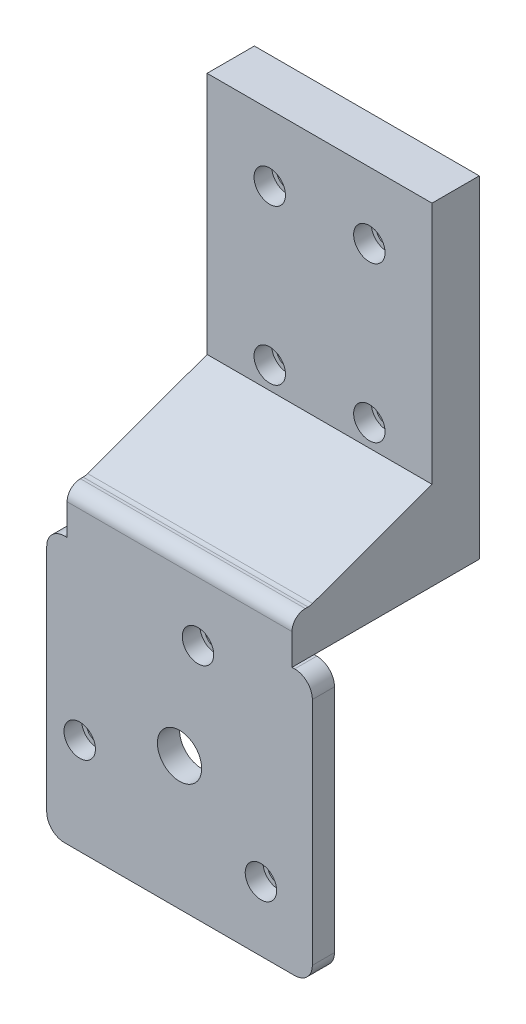
ISO-10303-21;
HEADER;
FILE_DESCRIPTION(('STEP AP214'),'2;1');
FILE_NAME('part.step','',(''),(''),'','','');
FILE_SCHEMA(('AUTOMOTIVE_DESIGN { 1 0 10303 214 1 1 1 1 }'));
ENDSEC;
DATA;
#1=APPLICATION_CONTEXT('core data for automotive mechanical design processes');
#2=APPLICATION_PROTOCOL_DEFINITION('international standard','automotive_design',2000,#1);
#3=PRODUCT_CONTEXT('',#1,'mechanical');
#4=PRODUCT('Part','Part','',(#3));
#5=PRODUCT_RELATED_PRODUCT_CATEGORY('part','',(#4));
#6=PRODUCT_DEFINITION_FORMATION('','',#4);
#7=PRODUCT_DEFINITION_CONTEXT('part definition',#1,'design');
#8=PRODUCT_DEFINITION('design','',#6,#7);
#9=PRODUCT_DEFINITION_SHAPE('','',#8);
#10=(LENGTH_UNIT() NAMED_UNIT(*) SI_UNIT(.MILLI.,.METRE.));
#11=(NAMED_UNIT(*) PLANE_ANGLE_UNIT() SI_UNIT($,.RADIAN.));
#12=(NAMED_UNIT(*) SI_UNIT($,.STERADIAN.) SOLID_ANGLE_UNIT());
#13=UNCERTAINTY_MEASURE_WITH_UNIT(LENGTH_MEASURE(1.E-05),#10,'distance_accuracy_value','');
#14=(GEOMETRIC_REPRESENTATION_CONTEXT(3) GLOBAL_UNCERTAINTY_ASSIGNED_CONTEXT((#13)) GLOBAL_UNIT_ASSIGNED_CONTEXT((#10,
#11,#12)) REPRESENTATION_CONTEXT('',''));
#15=CARTESIAN_POINT('',(0.,0.,0.));
#16=DIRECTION('',(0.,0.,1.));
#17=DIRECTION('',(1.,0.,0.));
#18=AXIS2_PLACEMENT_3D('',#15,#16,#17);
#19=CARTESIAN_POINT('',(-11.25,120.000000038,7.5));
#20=DIRECTION('',(0.,0.,-1.));
#21=DIRECTION('',(-1.,0.,0.));
#22=AXIS2_PLACEMENT_3D('',#19,#20,#21);
#23=CYLINDRICAL_SURFACE('',#22,2.5);
#24=CARTESIAN_POINT('',(-11.25,120.000000038,3.5));
#25=DIRECTION('',(0.,0.,1.));
#26=DIRECTION('',(1.,0.,0.));
#27=AXIS2_PLACEMENT_3D('',#24,#25,#26);
#28=CIRCLE('',#27,2.5);
#29=CARTESIAN_POINT('',(-8.75,120.000000038,3.5));
#30=VERTEX_POINT('',#29);
#31=EDGE_CURVE('E50',#30,#30,#28,.T.);
#32=ORIENTED_EDGE('',*,*,#31,.T.);
#33=EDGE_LOOP('',(#32));
#34=FACE_BOUND('',#33,.T.);
#35=CARTESIAN_POINT('',(-11.25,120.000000038,-3.18));
#36=DIRECTION('',(0.,0.,1.));
#37=DIRECTION('',(1.,0.,0.));
#38=AXIS2_PLACEMENT_3D('',#35,#36,#37);
#39=CIRCLE('',#38,2.5);
#40=CARTESIAN_POINT('',(-8.75,120.000000038,-3.18));
#41=VERTEX_POINT('',#40);
#42=EDGE_CURVE('E212',#41,#41,#39,.T.);
#43=ORIENTED_EDGE('',*,*,#42,.F.);
#44=EDGE_LOOP('',(#43));
#45=FACE_BOUND('',#44,.T.);
#46=ADVANCED_FACE('F43',(#34,#45),#23,.F.);
#47=CARTESIAN_POINT('',(11.25,120.000000038,7.5));
#48=DIRECTION('',(0.,0.,-1.));
#49=DIRECTION('',(-1.,0.,0.));
#50=AXIS2_PLACEMENT_3D('',#47,#48,#49);
#51=CYLINDRICAL_SURFACE('',#50,2.50000000000001);
#52=CARTESIAN_POINT('',(11.25,120.000000038,3.5));
#53=DIRECTION('',(0.,0.,1.));
#54=DIRECTION('',(1.,0.,0.));
#55=AXIS2_PLACEMENT_3D('',#52,#53,#54);
#56=CIRCLE('',#55,2.50000000000001);
#57=CARTESIAN_POINT('',(13.75,120.000000038,3.5));
#58=VERTEX_POINT('',#57);
#59=EDGE_CURVE('E398',#58,#58,#56,.T.);
#60=ORIENTED_EDGE('',*,*,#59,.T.);
#61=EDGE_LOOP('',(#60));
#62=FACE_BOUND('',#61,.T.);
#63=CARTESIAN_POINT('',(11.25,120.000000038,-3.18));
#64=DIRECTION('',(0.,0.,1.));
#65=DIRECTION('',(1.,0.,0.));
#66=AXIS2_PLACEMENT_3D('',#63,#64,#65);
#67=CIRCLE('',#66,2.50000000000001);
#68=CARTESIAN_POINT('',(13.75,120.000000038,-3.18));
#69=VERTEX_POINT('',#68);
#70=EDGE_CURVE('E206',#69,#69,#67,.T.);
#71=ORIENTED_EDGE('',*,*,#70,.F.);
#72=EDGE_LOOP('',(#71));
#73=FACE_BOUND('',#72,.T.);
#74=ADVANCED_FACE('F503',(#62,#73),#51,.F.);
#75=CARTESIAN_POINT('',(11.25,85.000000038,7.5));
#76=DIRECTION('',(0.,0.,-1.));
#77=DIRECTION('',(-1.,0.,0.));
#78=AXIS2_PLACEMENT_3D('',#75,#76,#77);
#79=CYLINDRICAL_SURFACE('',#78,2.5);
#80=CARTESIAN_POINT('',(11.25,85.000000038,3.5));
#81=DIRECTION('',(0.,0.,1.));
#82=DIRECTION('',(1.,0.,0.));
#83=AXIS2_PLACEMENT_3D('',#80,#81,#82);
#84=CIRCLE('',#83,2.5);
#85=CARTESIAN_POINT('',(13.75,85.000000038,3.5));
#86=VERTEX_POINT('',#85);
#87=EDGE_CURVE('E394',#86,#86,#84,.T.);
#88=ORIENTED_EDGE('',*,*,#87,.T.);
#89=EDGE_LOOP('',(#88));
#90=FACE_BOUND('',#89,.T.);
#91=CARTESIAN_POINT('',(11.25,85.000000038,-3.18));
#92=DIRECTION('',(0.,0.,1.));
#93=DIRECTION('',(1.,0.,0.));
#94=AXIS2_PLACEMENT_3D('',#91,#92,#93);
#95=CIRCLE('',#94,2.5);
#96=CARTESIAN_POINT('',(13.75,85.000000038,-3.18));
#97=VERTEX_POINT('',#96);
#98=EDGE_CURVE('E204',#97,#97,#95,.T.);
#99=ORIENTED_EDGE('',*,*,#98,.F.);
#100=EDGE_LOOP('',(#99));
#101=FACE_BOUND('',#100,.T.);
#102=ADVANCED_FACE('F508',(#90,#101),#79,.F.);
#103=CARTESIAN_POINT('',(-11.25,85.000000038,7.5));
#104=DIRECTION('',(0.,0.,-1.));
#105=DIRECTION('',(-1.,0.,0.));
#106=AXIS2_PLACEMENT_3D('',#103,#104,#105);
#107=CYLINDRICAL_SURFACE('',#106,2.50000000000001);
#108=CARTESIAN_POINT('',(-11.25,85.000000038,3.5));
#109=DIRECTION('',(0.,0.,1.));
#110=DIRECTION('',(1.,0.,0.));
#111=AXIS2_PLACEMENT_3D('',#108,#109,#110);
#112=CIRCLE('',#111,2.50000000000001);
#113=CARTESIAN_POINT('',(-8.74999999999999,85.000000038,3.5));
#114=VERTEX_POINT('',#113);
#115=EDGE_CURVE('E236',#114,#114,#112,.T.);
#116=ORIENTED_EDGE('',*,*,#115,.T.);
#117=EDGE_LOOP('',(#116));
#118=FACE_BOUND('',#117,.T.);
#119=CARTESIAN_POINT('',(-11.25,85.000000038,-3.18));
#120=DIRECTION('',(0.,0.,1.));
#121=DIRECTION('',(1.,0.,0.));
#122=AXIS2_PLACEMENT_3D('',#119,#120,#121);
#123=CIRCLE('',#122,2.50000000000001);
#124=CARTESIAN_POINT('',(-8.74999999999999,85.000000038,-3.18));
#125=VERTEX_POINT('',#124);
#126=EDGE_CURVE('E205',#125,#125,#123,.T.);
#127=ORIENTED_EDGE('',*,*,#126,.F.);
#128=EDGE_LOOP('',(#127));
#129=FACE_BOUND('',#128,.T.);
#130=ADVANCED_FACE('F517',(#118,#129),#107,.F.);
#131=CARTESIAN_POINT('',(18.3850666348554,14.573097367523,0.));
#132=DIRECTION('',(0.,0.,1.));
#133=DIRECTION('',(1.,0.,0.));
#134=AXIS2_PLACEMENT_3D('',#131,#132,#133);
#135=CYLINDRICAL_SURFACE('',#134,2.5);
#136=CARTESIAN_POINT('',(18.3850666348554,14.573097367523,34.125));
#137=DIRECTION('',(0.,0.,1.));
#138=DIRECTION('',(1.,0.,0.));
#139=AXIS2_PLACEMENT_3D('',#136,#137,#138);
#140=CIRCLE('',#139,2.5);
#141=CARTESIAN_POINT('',(20.8850666348554,14.573097367523,34.125));
#142=VERTEX_POINT('',#141);
#143=EDGE_CURVE('E260',#142,#142,#140,.T.);
#144=ORIENTED_EDGE('',*,*,#143,.F.);
#145=EDGE_LOOP('',(#144));
#146=FACE_BOUND('',#145,.T.);
#147=CARTESIAN_POINT('',(18.3850666348554,14.573097367523,35.125));
#148=DIRECTION('',(0.,0.,1.));
#149=DIRECTION('',(1.,0.,0.));
#150=AXIS2_PLACEMENT_3D('',#147,#148,#149);
#151=CIRCLE('',#150,2.5);
#152=CARTESIAN_POINT('',(20.8850666348554,14.573097367523,35.125));
#153=VERTEX_POINT('',#152);
#154=EDGE_CURVE('E265',#153,#153,#151,.F.);
#155=ORIENTED_EDGE('',*,*,#154,.F.);
#156=EDGE_LOOP('',(#155));
#157=FACE_BOUND('',#156,.T.);
#158=ADVANCED_FACE('F518',(#146,#157),#135,.F.);
#159=CARTESIAN_POINT('',(4.16755626400639,53.635386072293,0.));
#160=DIRECTION('',(0.,0.,1.));
#161=DIRECTION('',(1.,0.,0.));
#162=AXIS2_PLACEMENT_3D('',#159,#160,#161);
#163=CYLINDRICAL_SURFACE('',#162,2.5);
#164=CARTESIAN_POINT('',(4.16755626400639,53.635386072293,34.125));
#165=DIRECTION('',(0.,0.,1.));
#166=DIRECTION('',(1.,0.,0.));
#167=AXIS2_PLACEMENT_3D('',#164,#165,#166);
#168=CIRCLE('',#167,2.5);
#169=CARTESIAN_POINT('',(6.66755626400639,53.635386072293,34.125));
#170=VERTEX_POINT('',#169);
#171=EDGE_CURVE('E263',#170,#170,#168,.T.);
#172=ORIENTED_EDGE('',*,*,#171,.F.);
#173=EDGE_LOOP('',(#172));
#174=FACE_BOUND('',#173,.T.);
#175=CARTESIAN_POINT('',(4.16755626400639,53.635386072293,35.125));
#176=DIRECTION('',(0.,0.,1.));
#177=DIRECTION('',(1.,0.,0.));
#178=AXIS2_PLACEMENT_3D('',#175,#176,#177);
#179=CIRCLE('',#178,2.5);
#180=CARTESIAN_POINT('',(6.66755626400639,53.635386072293,35.125));
#181=VERTEX_POINT('',#180);
#182=EDGE_CURVE('E389',#181,#181,#179,.F.);
#183=ORIENTED_EDGE('',*,*,#182,.F.);
#184=EDGE_LOOP('',(#183));
#185=FACE_BOUND('',#184,.T.);
#186=ADVANCED_FACE('F562',(#174,#185),#163,.F.);
#187=CARTESIAN_POINT('',(-22.5526228988618,21.791516560184,0.));
#188=DIRECTION('',(0.,0.,1.));
#189=DIRECTION('',(1.,0.,0.));
#190=AXIS2_PLACEMENT_3D('',#187,#188,#189);
#191=CYLINDRICAL_SURFACE('',#190,2.5);
#192=CARTESIAN_POINT('',(-22.5526228988618,21.791516560184,34.125));
#193=DIRECTION('',(0.,0.,1.));
#194=DIRECTION('',(1.,0.,0.));
#195=AXIS2_PLACEMENT_3D('',#192,#193,#194);
#196=CIRCLE('',#195,2.5);
#197=CARTESIAN_POINT('',(-20.0526228988618,21.791516560184,34.125));
#198=VERTEX_POINT('',#197);
#199=EDGE_CURVE('E262',#198,#198,#196,.T.);
#200=ORIENTED_EDGE('',*,*,#199,.F.);
#201=EDGE_LOOP('',(#200));
#202=FACE_BOUND('',#201,.T.);
#203=CARTESIAN_POINT('',(-22.5526228988618,21.791516560184,35.125));
#204=DIRECTION('',(0.,0.,1.));
#205=DIRECTION('',(1.,0.,0.));
#206=AXIS2_PLACEMENT_3D('',#203,#204,#205);
#207=CIRCLE('',#206,2.5);
#208=CARTESIAN_POINT('',(-20.0526228988618,21.791516560184,35.125));
#209=VERTEX_POINT('',#208);
#210=EDGE_CURVE('E245',#209,#209,#207,.F.);
#211=ORIENTED_EDGE('',*,*,#210,.F.);
#212=EDGE_LOOP('',(#211));
#213=FACE_BOUND('',#212,.T.);
#214=ADVANCED_FACE('F584',(#202,#213),#191,.F.);
#215=CARTESIAN_POINT('',(-25.4,0.,7.5));
#216=DIRECTION('',(-1.,0.,0.));
#217=DIRECTION('',(0.,0.,1.));
#218=AXIS2_PLACEMENT_3D('',#215,#216,#217);
#219=PLANE('',#218);
#220=DIRECTION('',(0.,-1.,0.));
#221=VECTOR('',#220,1.);
#222=CARTESIAN_POINT('',(-25.4,0.,39.125));
#223=LINE('',#222,#221);
#224=CARTESIAN_POINT('',(-25.4,67.,39.125));
#225=VERTEX_POINT('',#224);
#226=CARTESIAN_POINT('',(-25.4,60.,39.125));
#227=VERTEX_POINT('',#226);
#228=EDGE_CURVE('E285',#225,#227,#223,.T.);
#229=ORIENTED_EDGE('',*,*,#228,.F.);
#230=CARTESIAN_POINT('',(-25.4,67.,36.125));
#231=DIRECTION('',(-1.,0.,0.));
#232=DIRECTION('',(0.,0.,1.));
#233=AXIS2_PLACEMENT_3D('',#230,#231,#232);
#234=CIRCLE('',#233,3.);
#235=CARTESIAN_POINT('',(-25.4,70.,36.125));
#236=VERTEX_POINT('',#235);
#237=EDGE_CURVE('E372',#225,#236,#234,.T.);
#238=ORIENTED_EDGE('',*,*,#237,.T.);
#239=DIRECTION('',(0.,0.,-1.));
#240=VECTOR('',#239,1.);
#241=CARTESIAN_POINT('',(-25.4,70.,34.125));
#242=LINE('',#241,#240);
#243=CARTESIAN_POINT('',(-25.4,70.,35.503755136672));
#244=VERTEX_POINT('',#243);
#245=EDGE_CURVE('E358',#236,#244,#242,.T.);
#246=ORIENTED_EDGE('',*,*,#245,.T.);
#247=CARTESIAN_POINT('',(-25.4,73.,35.503755136672));
#248=DIRECTION('',(-1.,0.,0.));
#249=DIRECTION('',(0.,0.,1.));
#250=AXIS2_PLACEMENT_3D('',#247,#248,#249);
#251=CIRCLE('',#250,3.);
#252=CARTESIAN_POINT('',(-25.4,70.1809221376423,34.4776947066951));
#253=VERTEX_POINT('',#252);
#254=EDGE_CURVE('E55',#244,#253,#251,.F.);
#255=ORIENTED_EDGE('',*,*,#254,.T.);
#256=DIRECTION('',(0.,-0.342020143325663,0.93969262078591));
#257=VECTOR('',#256,1.);
#258=CARTESIAN_POINT('',(-25.4,80.,7.5));
#259=LINE('',#258,#257);
#260=CARTESIAN_POINT('',(-25.4,80.,7.5));
#261=VERTEX_POINT('',#260);
#262=EDGE_CURVE('E367',#253,#261,#259,.F.);
#263=ORIENTED_EDGE('',*,*,#262,.T.);
#264=DIRECTION('',(0.,1.,0.));
#265=VECTOR('',#264,1.);
#266=CARTESIAN_POINT('',(-25.4,0.,7.5));
#267=LINE('',#266,#265);
#268=CARTESIAN_POINT('',(-25.4,135.000000038,7.5));
#269=VERTEX_POINT('',#268);
#270=EDGE_CURVE('E360',#261,#269,#267,.T.);
#271=ORIENTED_EDGE('',*,*,#270,.T.);
#272=DIRECTION('',(0.,0.,-1.));
#273=VECTOR('',#272,1.);
#274=CARTESIAN_POINT('',(-25.4,135.000000038,7.5));
#275=LINE('',#274,#273);
#276=CARTESIAN_POINT('',(-25.4,135.000000038,-3.18));
#277=VERTEX_POINT('',#276);
#278=EDGE_CURVE('E181',#269,#277,#275,.T.);
#279=ORIENTED_EDGE('',*,*,#278,.T.);
#280=DIRECTION('',(0.,1.,0.));
#281=VECTOR('',#280,1.);
#282=CARTESIAN_POINT('',(-25.4,0.,-3.18));
#283=LINE('',#282,#281);
#284=CARTESIAN_POINT('',(-25.4,60.,-3.18));
#285=VERTEX_POINT('',#284);
#286=EDGE_CURVE('E194',#285,#277,#283,.T.);
#287=ORIENTED_EDGE('',*,*,#286,.F.);
#288=DIRECTION('',(0.,0.,-1.));
#289=VECTOR('',#288,1.);
#290=CARTESIAN_POINT('',(-25.4,60.,34.125));
#291=LINE('',#290,#289);
#292=CARTESIAN_POINT('',(-25.4,60.,34.125));
#293=VERTEX_POINT('',#292);
#294=EDGE_CURVE('E352',#293,#285,#291,.T.);
#295=ORIENTED_EDGE('',*,*,#294,.F.);
#296=DIRECTION('',(0.,0.,-1.));
#297=VECTOR('',#296,1.);
#298=CARTESIAN_POINT('',(-25.4,60.,39.125));
#299=LINE('',#298,#297);
#300=EDGE_CURVE('E345',#227,#293,#299,.T.);
#301=ORIENTED_EDGE('',*,*,#300,.F.);
#302=EDGE_LOOP('',(#229,#238,#246,#255,#263,#271,#279,#287,#295,#301));
#303=FACE_BOUND('',#302,.T.);
#304=ADVANCED_FACE('F434',(#303),#219,.T.);
#305=CARTESIAN_POINT('',(25.4,0.,7.5));
#306=DIRECTION('',(1.,0.,0.));
#307=DIRECTION('',(0.,0.,-1.));
#308=AXIS2_PLACEMENT_3D('',#305,#306,#307);
#309=PLANE('',#308);
#310=DIRECTION('',(0.,0.,-1.));
#311=VECTOR('',#310,1.);
#312=CARTESIAN_POINT('',(25.4,70.,34.125));
#313=LINE('',#312,#311);
#314=CARTESIAN_POINT('',(25.4,70.,36.125));
#315=VERTEX_POINT('',#314);
#316=CARTESIAN_POINT('',(25.4,70.,35.503755136672));
#317=VERTEX_POINT('',#316);
#318=EDGE_CURVE('E353',#315,#317,#313,.T.);
#319=ORIENTED_EDGE('',*,*,#318,.F.);
#320=CARTESIAN_POINT('',(25.4,67.,36.125));
#321=DIRECTION('',(1.,0.,0.));
#322=DIRECTION('',(0.,0.,-1.));
#323=AXIS2_PLACEMENT_3D('',#320,#321,#322);
#324=CIRCLE('',#323,3.);
#325=CARTESIAN_POINT('',(25.4,67.,39.125));
#326=VERTEX_POINT('',#325);
#327=EDGE_CURVE('E382',#315,#326,#324,.T.);
#328=ORIENTED_EDGE('',*,*,#327,.T.);
#329=DIRECTION('',(0.,1.,0.));
#330=VECTOR('',#329,1.);
#331=CARTESIAN_POINT('',(25.4,0.,39.125));
#332=LINE('',#331,#330);
#333=CARTESIAN_POINT('',(25.4,60.,39.125));
#334=VERTEX_POINT('',#333);
#335=EDGE_CURVE('E280',#334,#326,#332,.T.);
#336=ORIENTED_EDGE('',*,*,#335,.F.);
#337=DIRECTION('',(0.,0.,-1.));
#338=VECTOR('',#337,1.);
#339=CARTESIAN_POINT('',(25.4,60.,39.125));
#340=LINE('',#339,#338);
#341=CARTESIAN_POINT('',(25.4,60.,34.125));
#342=VERTEX_POINT('',#341);
#343=EDGE_CURVE('E348',#334,#342,#340,.T.);
#344=ORIENTED_EDGE('',*,*,#343,.T.);
#345=DIRECTION('',(0.,0.,-1.));
#346=VECTOR('',#345,1.);
#347=CARTESIAN_POINT('',(25.4,60.,34.125));
#348=LINE('',#347,#346);
#349=CARTESIAN_POINT('',(25.4,60.,-3.18));
#350=VERTEX_POINT('',#349);
#351=EDGE_CURVE('E198',#342,#350,#348,.T.);
#352=ORIENTED_EDGE('',*,*,#351,.T.);
#353=DIRECTION('',(0.,-1.,0.));
#354=VECTOR('',#353,1.);
#355=CARTESIAN_POINT('',(25.4,0.,-3.18));
#356=LINE('',#355,#354);
#357=CARTESIAN_POINT('',(25.4,135.000000038,-3.18));
#358=VERTEX_POINT('',#357);
#359=EDGE_CURVE('E186',#358,#350,#356,.T.);
#360=ORIENTED_EDGE('',*,*,#359,.F.);
#361=DIRECTION('',(0.,0.,-1.));
#362=VECTOR('',#361,1.);
#363=CARTESIAN_POINT('',(25.4,135.000000038,7.5));
#364=LINE('',#363,#362);
#365=CARTESIAN_POINT('',(25.4,135.000000038,7.5));
#366=VERTEX_POINT('',#365);
#367=EDGE_CURVE('E167',#366,#358,#364,.T.);
#368=ORIENTED_EDGE('',*,*,#367,.F.);
#369=DIRECTION('',(0.,-1.,0.));
#370=VECTOR('',#369,1.);
#371=CARTESIAN_POINT('',(25.4,0.,7.5));
#372=LINE('',#371,#370);
#373=CARTESIAN_POINT('',(25.4,80.,7.5));
#374=VERTEX_POINT('',#373);
#375=EDGE_CURVE('E363',#366,#374,#372,.T.);
#376=ORIENTED_EDGE('',*,*,#375,.T.);
#377=DIRECTION('',(0.,0.342020143325663,-0.93969262078591));
#378=VECTOR('',#377,1.);
#379=CARTESIAN_POINT('',(25.4,80.,7.5));
#380=LINE('',#379,#378);
#381=CARTESIAN_POINT('',(25.4,70.1809221376423,34.4776947066951));
#382=VERTEX_POINT('',#381);
#383=EDGE_CURVE('E370',#374,#382,#380,.F.);
#384=ORIENTED_EDGE('',*,*,#383,.T.);
#385=CARTESIAN_POINT('',(25.4,73.,35.503755136672));
#386=DIRECTION('',(1.,0.,0.));
#387=DIRECTION('',(0.,0.,-1.));
#388=AXIS2_PLACEMENT_3D('',#385,#386,#387);
#389=CIRCLE('',#388,3.);
#390=EDGE_CURVE('E11',#382,#317,#389,.F.);
#391=ORIENTED_EDGE('',*,*,#390,.T.);
#392=EDGE_LOOP('',(#319,#328,#336,#344,#352,#360,#368,#376,#384,#391));
#393=FACE_BOUND('',#392,.T.);
#394=ADVANCED_FACE('F191',(#393),#309,.T.);
#395=CARTESIAN_POINT('',(0.,135.000000038,7.5));
#396=DIRECTION('',(0.,1.,0.));
#397=DIRECTION('',(0.,0.,1.));
#398=AXIS2_PLACEMENT_3D('',#395,#396,#397);
#399=PLANE('',#398);
#400=ORIENTED_EDGE('',*,*,#367,.T.);
#401=DIRECTION('',(1.,0.,0.));
#402=VECTOR('',#401,1.);
#403=CARTESIAN_POINT('',(0.,135.000000038,-3.18));
#404=LINE('',#403,#402);
#405=EDGE_CURVE('E172',#277,#358,#404,.T.);
#406=ORIENTED_EDGE('',*,*,#405,.F.);
#407=ORIENTED_EDGE('',*,*,#278,.F.);
#408=DIRECTION('',(1.,0.,0.));
#409=VECTOR('',#408,1.);
#410=CARTESIAN_POINT('',(0.,135.000000038,7.5));
#411=LINE('',#410,#409);
#412=EDGE_CURVE('E176',#269,#366,#411,.T.);
#413=ORIENTED_EDGE('',*,*,#412,.T.);
#414=EDGE_LOOP('',(#400,#406,#407,#413));
#415=FACE_BOUND('',#414,.T.);
#416=ADVANCED_FACE('F175',(#415),#399,.T.);
#417=CARTESIAN_POINT('',(0.,0.,7.5));
#418=DIRECTION('',(0.,0.,1.));
#419=DIRECTION('',(1.,0.,0.));
#420=AXIS2_PLACEMENT_3D('',#417,#418,#419);
#421=PLANE('',#420);
#422=CARTESIAN_POINT('',(11.25,120.000000038,7.5));
#423=DIRECTION('',(0.,0.,1.));
#424=DIRECTION('',(1.,0.,0.));
#425=AXIS2_PLACEMENT_3D('',#422,#423,#424);
#426=CIRCLE('',#425,3.55);
#427=CARTESIAN_POINT('',(14.8,120.000000038,7.5));
#428=VERTEX_POINT('',#427);
#429=EDGE_CURVE('E223',#428,#428,#426,.T.);
#430=ORIENTED_EDGE('',*,*,#429,.F.);
#431=EDGE_LOOP('',(#430));
#432=FACE_BOUND('',#431,.T.);
#433=CARTESIAN_POINT('',(-11.25,85.000000038,7.5));
#434=DIRECTION('',(0.,0.,1.));
#435=DIRECTION('',(1.,0.,0.));
#436=AXIS2_PLACEMENT_3D('',#433,#434,#435);
#437=CIRCLE('',#436,3.55);
#438=CARTESIAN_POINT('',(-7.70000000000001,85.000000038,7.5));
#439=VERTEX_POINT('',#438);
#440=EDGE_CURVE('E226',#439,#439,#437,.T.);
#441=ORIENTED_EDGE('',*,*,#440,.F.);
#442=EDGE_LOOP('',(#441));
#443=FACE_BOUND('',#442,.T.);
#444=CARTESIAN_POINT('',(11.25,85.000000038,7.5));
#445=DIRECTION('',(0.,0.,1.));
#446=DIRECTION('',(1.,0.,0.));
#447=AXIS2_PLACEMENT_3D('',#444,#445,#446);
#448=CIRCLE('',#447,3.55);
#449=CARTESIAN_POINT('',(14.8,85.000000038,7.5));
#450=VERTEX_POINT('',#449);
#451=EDGE_CURVE('E213',#450,#450,#448,.T.);
#452=ORIENTED_EDGE('',*,*,#451,.F.);
#453=EDGE_LOOP('',(#452));
#454=FACE_BOUND('',#453,.T.);
#455=CARTESIAN_POINT('',(-11.25,120.000000038,7.5));
#456=DIRECTION('',(0.,0.,1.));
#457=DIRECTION('',(1.,0.,0.));
#458=AXIS2_PLACEMENT_3D('',#455,#456,#457);
#459=CIRCLE('',#458,3.55);
#460=CARTESIAN_POINT('',(-7.7,120.000000038,7.5));
#461=VERTEX_POINT('',#460);
#462=EDGE_CURVE('E222',#461,#461,#459,.T.);
#463=ORIENTED_EDGE('',*,*,#462,.F.);
#464=EDGE_LOOP('',(#463));
#465=FACE_BOUND('',#464,.T.);
#466=ORIENTED_EDGE('',*,*,#270,.F.);
#467=DIRECTION('',(1.,0.,0.));
#468=VECTOR('',#467,1.);
#469=CARTESIAN_POINT('',(25.4,80.,7.5));
#470=LINE('',#469,#468);
#471=EDGE_CURVE('E179',#261,#374,#470,.T.);
#472=ORIENTED_EDGE('',*,*,#471,.T.);
#473=ORIENTED_EDGE('',*,*,#375,.F.);
#474=ORIENTED_EDGE('',*,*,#412,.F.);
#475=EDGE_LOOP('',(#466,#472,#473,#474));
#476=FACE_BOUND('',#475,.T.);
#477=ADVANCED_FACE('F417',(#432,#443,#454,#465,#476),#421,.T.);
#478=CARTESIAN_POINT('',(0.,70.,34.125));
#479=DIRECTION('',(0.,1.,0.));
#480=DIRECTION('',(0.,0.,1.));
#481=AXIS2_PLACEMENT_3D('',#478,#479,#480);
#482=PLANE('',#481);
#483=ORIENTED_EDGE('',*,*,#245,.F.);
#484=DIRECTION('',(-1.,0.,0.));
#485=VECTOR('',#484,1.);
#486=CARTESIAN_POINT('',(0.,70.,36.125));
#487=LINE('',#486,#485);
#488=EDGE_CURVE('E378',#236,#315,#487,.F.);
#489=ORIENTED_EDGE('',*,*,#488,.T.);
#490=ORIENTED_EDGE('',*,*,#318,.T.);
#491=DIRECTION('',(1.,0.,0.));
#492=VECTOR('',#491,1.);
#493=CARTESIAN_POINT('',(0.,70.,35.503755136672));
#494=LINE('',#493,#492);
#495=EDGE_CURVE('E376',#317,#244,#494,.F.);
#496=ORIENTED_EDGE('',*,*,#495,.T.);
#497=EDGE_LOOP('',(#483,#489,#490,#496));
#498=FACE_BOUND('',#497,.T.);
#499=ADVANCED_FACE('F422',(#498),#482,.T.);
#500=CARTESIAN_POINT('',(0.,60.,34.125));
#501=DIRECTION('',(0.,1.,0.));
#502=DIRECTION('',(0.,0.,1.));
#503=AXIS2_PLACEMENT_3D('',#500,#501,#502);
#504=PLANE('',#503);
#505=ORIENTED_EDGE('',*,*,#294,.T.);
#506=DIRECTION('',(1.,0.,0.));
#507=VECTOR('',#506,1.);
#508=CARTESIAN_POINT('',(0.,60.,-3.18));
#509=LINE('',#508,#507);
#510=EDGE_CURVE('E197',#285,#350,#509,.T.);
#511=ORIENTED_EDGE('',*,*,#510,.T.);
#512=ORIENTED_EDGE('',*,*,#351,.F.);
#513=DIRECTION('',(1.,0.,0.));
#514=VECTOR('',#513,1.);
#515=CARTESIAN_POINT('',(0.,60.,34.125));
#516=LINE('',#515,#514);
#517=EDGE_CURVE('E346',#293,#342,#516,.T.);
#518=ORIENTED_EDGE('',*,*,#517,.F.);
#519=EDGE_LOOP('',(#505,#511,#512,#518));
#520=FACE_BOUND('',#519,.T.);
#521=ADVANCED_FACE('F460',(#520),#504,.F.);
#522=CARTESIAN_POINT('',(-26.,56.,34.125));
#523=DIRECTION('',(0.,0.,1.));
#524=DIRECTION('',(1.,0.,0.));
#525=AXIS2_PLACEMENT_3D('',#522,#523,#524);
#526=PLANE('',#525);
#527=ORIENTED_EDGE('',*,*,#199,.T.);
#528=EDGE_LOOP('',(#527));
#529=FACE_BOUND('',#528,.T.);
#530=ORIENTED_EDGE('',*,*,#171,.T.);
#531=EDGE_LOOP('',(#530));
#532=FACE_BOUND('',#531,.T.);
#533=ORIENTED_EDGE('',*,*,#143,.T.);
#534=EDGE_LOOP('',(#533));
#535=FACE_BOUND('',#534,.T.);
#536=CARTESIAN_POINT('',(0.,30.,34.125));
#537=DIRECTION('',(0.,0.,1.));
#538=DIRECTION('',(1.,0.,0.));
#539=AXIS2_PLACEMENT_3D('',#536,#537,#538);
#540=CIRCLE('',#539,5.);
#541=CARTESIAN_POINT('',(5.,30.,34.125));
#542=VERTEX_POINT('',#541);
#543=EDGE_CURVE('E272',#542,#542,#540,.T.);
#544=ORIENTED_EDGE('',*,*,#543,.T.);
#545=EDGE_LOOP('',(#544));
#546=FACE_BOUND('',#545,.T.);
#547=DIRECTION('',(-1.,0.,0.));
#548=VECTOR('',#547,1.);
#549=CARTESIAN_POINT('',(0.,60.,34.125));
#550=LINE('',#549,#548);
#551=CARTESIAN_POINT('',(-26.,60.,34.125));
#552=VERTEX_POINT('',#551);
#553=EDGE_CURVE('E304',#293,#552,#550,.T.);
#554=ORIENTED_EDGE('',*,*,#553,.F.);
#555=ORIENTED_EDGE('',*,*,#517,.T.);
#556=DIRECTION('',(-1.,0.,0.));
#557=VECTOR('',#556,1.);
#558=CARTESIAN_POINT('',(0.,60.,34.125));
#559=LINE('',#558,#557);
#560=CARTESIAN_POINT('',(26.,60.,34.125));
#561=VERTEX_POINT('',#560);
#562=EDGE_CURVE('E274',#561,#342,#559,.T.);
#563=ORIENTED_EDGE('',*,*,#562,.F.);
#564=CARTESIAN_POINT('',(26.,56.,34.125));
#565=DIRECTION('',(0.,0.,1.));
#566=DIRECTION('',(1.,0.,0.));
#567=AXIS2_PLACEMENT_3D('',#564,#565,#566);
#568=CIRCLE('',#567,4.);
#569=CARTESIAN_POINT('',(30.,56.,34.125));
#570=VERTEX_POINT('',#569);
#571=EDGE_CURVE('E276',#570,#561,#568,.T.);
#572=ORIENTED_EDGE('',*,*,#571,.F.);
#573=DIRECTION('',(0.,1.,0.));
#574=VECTOR('',#573,1.);
#575=CARTESIAN_POINT('',(30.,0.,34.125));
#576=LINE('',#575,#574);
#577=CARTESIAN_POINT('',(30.,4.,34.125));
#578=VERTEX_POINT('',#577);
#579=EDGE_CURVE('E322',#578,#570,#576,.T.);
#580=ORIENTED_EDGE('',*,*,#579,.F.);
#581=CARTESIAN_POINT('',(26.,4.,34.125));
#582=DIRECTION('',(0.,0.,1.));
#583=DIRECTION('',(1.,0.,0.));
#584=AXIS2_PLACEMENT_3D('',#581,#582,#583);
#585=CIRCLE('',#584,4.);
#586=CARTESIAN_POINT('',(26.,0.,34.125));
#587=VERTEX_POINT('',#586);
#588=EDGE_CURVE('E316',#587,#578,#585,.T.);
#589=ORIENTED_EDGE('',*,*,#588,.F.);
#590=DIRECTION('',(-1.,0.,0.));
#591=VECTOR('',#590,1.);
#592=CARTESIAN_POINT('',(0.,0.,34.125));
#593=LINE('',#592,#591);
#594=CARTESIAN_POINT('',(-26.,0.,34.125));
#595=VERTEX_POINT('',#594);
#596=EDGE_CURVE('E317',#587,#595,#593,.T.);
#597=ORIENTED_EDGE('',*,*,#596,.T.);
#598=CARTESIAN_POINT('',(-26.,4.,34.125));
#599=DIRECTION('',(0.,0.,1.));
#600=DIRECTION('',(1.,0.,0.));
#601=AXIS2_PLACEMENT_3D('',#598,#599,#600);
#602=CIRCLE('',#601,4.);
#603=CARTESIAN_POINT('',(-30.,4.,34.125));
#604=VERTEX_POINT('',#603);
#605=EDGE_CURVE('E312',#604,#595,#602,.T.);
#606=ORIENTED_EDGE('',*,*,#605,.F.);
#607=DIRECTION('',(0.,1.,0.));
#608=VECTOR('',#607,1.);
#609=CARTESIAN_POINT('',(-30.,0.,34.125));
#610=LINE('',#609,#608);
#611=CARTESIAN_POINT('',(-30.,56.,34.125));
#612=VERTEX_POINT('',#611);
#613=EDGE_CURVE('E309',#604,#612,#610,.T.);
#614=ORIENTED_EDGE('',*,*,#613,.T.);
#615=CARTESIAN_POINT('',(-26.,56.,34.125));
#616=DIRECTION('',(0.,0.,1.));
#617=DIRECTION('',(1.,0.,0.));
#618=AXIS2_PLACEMENT_3D('',#615,#616,#617);
#619=CIRCLE('',#618,4.);
#620=EDGE_CURVE('E310',#552,#612,#619,.T.);
#621=ORIENTED_EDGE('',*,*,#620,.F.);
#622=EDGE_LOOP('',(#554,#555,#563,#572,#580,#589,#597,#606,#614,#621));
#623=FACE_BOUND('',#622,.T.);
#624=ADVANCED_FACE('F454',(#529,#532,#535,#546,#623),#526,.F.);
#625=CARTESIAN_POINT('',(0.,60.,39.125));
#626=DIRECTION('',(0.,-1.,0.));
#627=DIRECTION('',(0.,0.,-1.));
#628=AXIS2_PLACEMENT_3D('',#625,#626,#627);
#629=PLANE('',#628);
#630=ORIENTED_EDGE('',*,*,#562,.T.);
#631=ORIENTED_EDGE('',*,*,#343,.F.);
#632=DIRECTION('',(-1.,0.,0.));
#633=VECTOR('',#632,1.);
#634=CARTESIAN_POINT('',(0.,60.,39.125));
#635=LINE('',#634,#633);
#636=CARTESIAN_POINT('',(26.,60.,39.125));
#637=VERTEX_POINT('',#636);
#638=EDGE_CURVE('E273',#637,#334,#635,.T.);
#639=ORIENTED_EDGE('',*,*,#638,.F.);
#640=DIRECTION('',(0.,0.,-1.));
#641=VECTOR('',#640,1.);
#642=CARTESIAN_POINT('',(26.,60.,39.125));
#643=LINE('',#642,#641);
#644=EDGE_CURVE('E305',#637,#561,#643,.T.);
#645=ORIENTED_EDGE('',*,*,#644,.T.);
#646=EDGE_LOOP('',(#630,#631,#639,#645));
#647=FACE_BOUND('',#646,.T.);
#648=ADVANCED_FACE('F450',(#647),#629,.F.);
#649=CARTESIAN_POINT('',(0.,60.,39.125));
#650=DIRECTION('',(0.,-1.,0.));
#651=DIRECTION('',(0.,0.,-1.));
#652=AXIS2_PLACEMENT_3D('',#649,#650,#651);
#653=PLANE('',#652);
#654=ORIENTED_EDGE('',*,*,#553,.T.);
#655=DIRECTION('',(0.,0.,-1.));
#656=VECTOR('',#655,1.);
#657=CARTESIAN_POINT('',(-26.,60.,39.125));
#658=LINE('',#657,#656);
#659=CARTESIAN_POINT('',(-26.,60.,39.125));
#660=VERTEX_POINT('',#659);
#661=EDGE_CURVE('E338',#660,#552,#658,.T.);
#662=ORIENTED_EDGE('',*,*,#661,.F.);
#663=DIRECTION('',(-1.,0.,0.));
#664=VECTOR('',#663,1.);
#665=CARTESIAN_POINT('',(0.,60.,39.125));
#666=LINE('',#665,#664);
#667=EDGE_CURVE('E284',#227,#660,#666,.T.);
#668=ORIENTED_EDGE('',*,*,#667,.F.);
#669=ORIENTED_EDGE('',*,*,#300,.T.);
#670=EDGE_LOOP('',(#654,#662,#668,#669));
#671=FACE_BOUND('',#670,.T.);
#672=ADVANCED_FACE('F457',(#671),#653,.F.);
#673=CARTESIAN_POINT('',(-26.,56.,39.125));
#674=DIRECTION('',(0.,0.,-1.));
#675=DIRECTION('',(-1.,0.,0.));
#676=AXIS2_PLACEMENT_3D('',#673,#674,#675);
#677=CYLINDRICAL_SURFACE('',#676,4.);
#678=ORIENTED_EDGE('',*,*,#620,.T.);
#679=DIRECTION('',(0.,0.,-1.));
#680=VECTOR('',#679,1.);
#681=CARTESIAN_POINT('',(-30.,56.,39.125));
#682=LINE('',#681,#680);
#683=CARTESIAN_POINT('',(-30.,56.,39.125));
#684=VERTEX_POINT('',#683);
#685=EDGE_CURVE('E336',#684,#612,#682,.T.);
#686=ORIENTED_EDGE('',*,*,#685,.F.);
#687=CARTESIAN_POINT('',(-26.,56.,39.125));
#688=DIRECTION('',(0.,0.,1.));
#689=DIRECTION('',(1.,0.,0.));
#690=AXIS2_PLACEMENT_3D('',#687,#688,#689);
#691=CIRCLE('',#690,4.);
#692=EDGE_CURVE('E288',#660,#684,#691,.T.);
#693=ORIENTED_EDGE('',*,*,#692,.F.);
#694=ORIENTED_EDGE('',*,*,#661,.T.);
#695=EDGE_LOOP('',(#678,#686,#693,#694));
#696=FACE_BOUND('',#695,.T.);
#697=ADVANCED_FACE('F467',(#696),#677,.T.);
#698=CARTESIAN_POINT('',(-30.,0.,39.125));
#699=DIRECTION('',(-1.,0.,0.));
#700=DIRECTION('',(0.,0.,1.));
#701=AXIS2_PLACEMENT_3D('',#698,#699,#700);
#702=PLANE('',#701);
#703=ORIENTED_EDGE('',*,*,#613,.F.);
#704=DIRECTION('',(0.,0.,-1.));
#705=VECTOR('',#704,1.);
#706=CARTESIAN_POINT('',(-30.,4.,39.125));
#707=LINE('',#706,#705);
#708=CARTESIAN_POINT('',(-30.,4.,39.125));
#709=VERTEX_POINT('',#708);
#710=EDGE_CURVE('E337',#709,#604,#707,.T.);
#711=ORIENTED_EDGE('',*,*,#710,.F.);
#712=DIRECTION('',(0.,1.,0.));
#713=VECTOR('',#712,1.);
#714=CARTESIAN_POINT('',(-30.,0.,39.125));
#715=LINE('',#714,#713);
#716=EDGE_CURVE('E286',#709,#684,#715,.T.);
#717=ORIENTED_EDGE('',*,*,#716,.T.);
#718=ORIENTED_EDGE('',*,*,#685,.T.);
#719=EDGE_LOOP('',(#703,#711,#717,#718));
#720=FACE_BOUND('',#719,.T.);
#721=ADVANCED_FACE('F469',(#720),#702,.T.);
#722=CARTESIAN_POINT('',(-26.,4.,39.125));
#723=DIRECTION('',(0.,0.,-1.));
#724=DIRECTION('',(-1.,0.,0.));
#725=AXIS2_PLACEMENT_3D('',#722,#723,#724);
#726=CYLINDRICAL_SURFACE('',#725,4.);
#727=ORIENTED_EDGE('',*,*,#605,.T.);
#728=DIRECTION('',(0.,0.,-1.));
#729=VECTOR('',#728,1.);
#730=CARTESIAN_POINT('',(-26.,0.,39.125));
#731=LINE('',#730,#729);
#732=CARTESIAN_POINT('',(-26.,0.,39.125));
#733=VERTEX_POINT('',#732);
#734=EDGE_CURVE('E332',#733,#595,#731,.T.);
#735=ORIENTED_EDGE('',*,*,#734,.F.);
#736=CARTESIAN_POINT('',(-26.,4.,39.125));
#737=DIRECTION('',(0.,0.,1.));
#738=DIRECTION('',(1.,0.,0.));
#739=AXIS2_PLACEMENT_3D('',#736,#737,#738);
#740=CIRCLE('',#739,4.);
#741=EDGE_CURVE('E293',#709,#733,#740,.T.);
#742=ORIENTED_EDGE('',*,*,#741,.F.);
#743=ORIENTED_EDGE('',*,*,#710,.T.);
#744=EDGE_LOOP('',(#727,#735,#742,#743));
#745=FACE_BOUND('',#744,.T.);
#746=ADVANCED_FACE('F471',(#745),#726,.T.);
#747=CARTESIAN_POINT('',(0.,0.,39.125));
#748=DIRECTION('',(0.,-1.,0.));
#749=DIRECTION('',(0.,0.,-1.));
#750=AXIS2_PLACEMENT_3D('',#747,#748,#749);
#751=PLANE('',#750);
#752=ORIENTED_EDGE('',*,*,#596,.F.);
#753=DIRECTION('',(0.,0.,-1.));
#754=VECTOR('',#753,1.);
#755=CARTESIAN_POINT('',(26.,0.,39.125));
#756=LINE('',#755,#754);
#757=CARTESIAN_POINT('',(26.,0.,39.125));
#758=VERTEX_POINT('',#757);
#759=EDGE_CURVE('E335',#758,#587,#756,.T.);
#760=ORIENTED_EDGE('',*,*,#759,.F.);
#761=DIRECTION('',(-1.,0.,0.));
#762=VECTOR('',#761,1.);
#763=CARTESIAN_POINT('',(0.,0.,39.125));
#764=LINE('',#763,#762);
#765=EDGE_CURVE('E291',#758,#733,#764,.T.);
#766=ORIENTED_EDGE('',*,*,#765,.T.);
#767=ORIENTED_EDGE('',*,*,#734,.T.);
#768=EDGE_LOOP('',(#752,#760,#766,#767));
#769=FACE_BOUND('',#768,.T.);
#770=ADVANCED_FACE('F477',(#769),#751,.T.);
#771=CARTESIAN_POINT('',(26.,4.,39.125));
#772=DIRECTION('',(0.,0.,-1.));
#773=DIRECTION('',(-1.,0.,0.));
#774=AXIS2_PLACEMENT_3D('',#771,#772,#773);
#775=CYLINDRICAL_SURFACE('',#774,4.);
#776=ORIENTED_EDGE('',*,*,#588,.T.);
#777=DIRECTION('',(0.,0.,-1.));
#778=VECTOR('',#777,1.);
#779=CARTESIAN_POINT('',(30.,4.,39.125));
#780=LINE('',#779,#778);
#781=CARTESIAN_POINT('',(30.,4.,39.125));
#782=VERTEX_POINT('',#781);
#783=EDGE_CURVE('E329',#782,#578,#780,.T.);
#784=ORIENTED_EDGE('',*,*,#783,.F.);
#785=CARTESIAN_POINT('',(26.,4.,39.125));
#786=DIRECTION('',(0.,0.,1.));
#787=DIRECTION('',(1.,0.,0.));
#788=AXIS2_PLACEMENT_3D('',#785,#786,#787);
#789=CIRCLE('',#788,4.);
#790=EDGE_CURVE('E298',#758,#782,#789,.T.);
#791=ORIENTED_EDGE('',*,*,#790,.F.);
#792=ORIENTED_EDGE('',*,*,#759,.T.);
#793=EDGE_LOOP('',(#776,#784,#791,#792));
#794=FACE_BOUND('',#793,.T.);
#795=ADVANCED_FACE('F481',(#794),#775,.T.);
#796=CARTESIAN_POINT('',(30.,0.,39.125));
#797=DIRECTION('',(-1.,0.,0.));
#798=DIRECTION('',(0.,0.,1.));
#799=AXIS2_PLACEMENT_3D('',#796,#797,#798);
#800=PLANE('',#799);
#801=ORIENTED_EDGE('',*,*,#579,.T.);
#802=DIRECTION('',(0.,0.,-1.));
#803=VECTOR('',#802,1.);
#804=CARTESIAN_POINT('',(30.,56.,39.125));
#805=LINE('',#804,#803);
#806=CARTESIAN_POINT('',(30.,56.,39.125));
#807=VERTEX_POINT('',#806);
#808=EDGE_CURVE('E328',#807,#570,#805,.T.);
#809=ORIENTED_EDGE('',*,*,#808,.F.);
#810=DIRECTION('',(0.,1.,0.));
#811=VECTOR('',#810,1.);
#812=CARTESIAN_POINT('',(30.,0.,39.125));
#813=LINE('',#812,#811);
#814=EDGE_CURVE('E296',#782,#807,#813,.T.);
#815=ORIENTED_EDGE('',*,*,#814,.F.);
#816=ORIENTED_EDGE('',*,*,#783,.T.);
#817=EDGE_LOOP('',(#801,#809,#815,#816));
#818=FACE_BOUND('',#817,.T.);
#819=ADVANCED_FACE('F487',(#818),#800,.F.);
#820=CARTESIAN_POINT('',(26.,56.,39.125));
#821=DIRECTION('',(0.,0.,-1.));
#822=DIRECTION('',(-1.,0.,0.));
#823=AXIS2_PLACEMENT_3D('',#820,#821,#822);
#824=CYLINDRICAL_SURFACE('',#823,4.);
#825=ORIENTED_EDGE('',*,*,#571,.T.);
#826=ORIENTED_EDGE('',*,*,#644,.F.);
#827=CARTESIAN_POINT('',(26.,56.,39.125));
#828=DIRECTION('',(0.,0.,1.));
#829=DIRECTION('',(1.,0.,0.));
#830=AXIS2_PLACEMENT_3D('',#827,#828,#829);
#831=CIRCLE('',#830,4.);
#832=EDGE_CURVE('E297',#807,#637,#831,.T.);
#833=ORIENTED_EDGE('',*,*,#832,.F.);
#834=ORIENTED_EDGE('',*,*,#808,.T.);
#835=EDGE_LOOP('',(#825,#826,#833,#834));
#836=FACE_BOUND('',#835,.T.);
#837=ADVANCED_FACE('F489',(#836),#824,.T.);
#838=CARTESIAN_POINT('',(-26.,56.,39.125));
#839=DIRECTION('',(0.,0.,1.));
#840=DIRECTION('',(1.,0.,0.));
#841=AXIS2_PLACEMENT_3D('',#838,#839,#840);
#842=PLANE('',#841);
#843=CARTESIAN_POINT('',(4.16755626400639,53.635386072293,39.125));
#844=DIRECTION('',(0.,0.,1.));
#845=DIRECTION('',(1.,0.,0.));
#846=AXIS2_PLACEMENT_3D('',#843,#844,#845);
#847=CIRCLE('',#846,3.55);
#848=CARTESIAN_POINT('',(7.71755626400639,53.635386072293,39.125));
#849=VERTEX_POINT('',#848);
#850=EDGE_CURVE('E243',#849,#849,#847,.T.);
#851=ORIENTED_EDGE('',*,*,#850,.F.);
#852=EDGE_LOOP('',(#851));
#853=FACE_BOUND('',#852,.T.);
#854=CARTESIAN_POINT('',(-22.5526228988618,21.791516560184,39.125));
#855=DIRECTION('',(0.,0.,1.));
#856=DIRECTION('',(1.,0.,0.));
#857=AXIS2_PLACEMENT_3D('',#854,#855,#856);
#858=CIRCLE('',#857,3.55);
#859=CARTESIAN_POINT('',(-19.0026228988618,21.791516560184,39.125));
#860=VERTEX_POINT('',#859);
#861=EDGE_CURVE('E246',#860,#860,#858,.T.);
#862=ORIENTED_EDGE('',*,*,#861,.F.);
#863=EDGE_LOOP('',(#862));
#864=FACE_BOUND('',#863,.T.);
#865=CARTESIAN_POINT('',(18.3850666348554,14.573097367523,39.125));
#866=DIRECTION('',(0.,0.,1.));
#867=DIRECTION('',(1.,0.,0.));
#868=AXIS2_PLACEMENT_3D('',#865,#866,#867);
#869=CIRCLE('',#868,3.55);
#870=CARTESIAN_POINT('',(21.9350666348554,14.573097367523,39.125));
#871=VERTEX_POINT('',#870);
#872=EDGE_CURVE('E255',#871,#871,#869,.T.);
#873=ORIENTED_EDGE('',*,*,#872,.F.);
#874=EDGE_LOOP('',(#873));
#875=FACE_BOUND('',#874,.T.);
#876=CARTESIAN_POINT('',(0.,30.,39.125));
#877=DIRECTION('',(0.,0.,1.));
#878=DIRECTION('',(1.,0.,0.));
#879=AXIS2_PLACEMENT_3D('',#876,#877,#878);
#880=CIRCLE('',#879,5.);
#881=CARTESIAN_POINT('',(5.,30.,39.125));
#882=VERTEX_POINT('',#881);
#883=EDGE_CURVE('E266',#882,#882,#880,.T.);
#884=ORIENTED_EDGE('',*,*,#883,.F.);
#885=EDGE_LOOP('',(#884));
#886=FACE_BOUND('',#885,.T.);
#887=ORIENTED_EDGE('',*,*,#335,.T.);
#888=DIRECTION('',(-1.,0.,0.));
#889=VECTOR('',#888,1.);
#890=CARTESIAN_POINT('',(-26.,67.,39.125));
#891=LINE('',#890,#889);
#892=EDGE_CURVE('E371',#326,#225,#891,.T.);
#893=ORIENTED_EDGE('',*,*,#892,.T.);
#894=ORIENTED_EDGE('',*,*,#228,.T.);
#895=ORIENTED_EDGE('',*,*,#667,.T.);
#896=ORIENTED_EDGE('',*,*,#692,.T.);
#897=ORIENTED_EDGE('',*,*,#716,.F.);
#898=ORIENTED_EDGE('',*,*,#741,.T.);
#899=ORIENTED_EDGE('',*,*,#765,.F.);
#900=ORIENTED_EDGE('',*,*,#790,.T.);
#901=ORIENTED_EDGE('',*,*,#814,.T.);
#902=ORIENTED_EDGE('',*,*,#832,.T.);
#903=ORIENTED_EDGE('',*,*,#638,.T.);
#904=EDGE_LOOP('',(#887,#893,#894,#895,#896,#897,#898,#899,#900,#901,#902,#903));
#905=FACE_BOUND('',#904,.T.);
#906=ADVANCED_FACE('F445',(#853,#864,#875,#886,#905),#842,.T.);
#907=CARTESIAN_POINT('',(0.,80.,7.5));
#908=DIRECTION('',(0.,0.93969262078591,0.342020143325663));
#909=DIRECTION('',(-1.,0.,0.));
#910=AXIS2_PLACEMENT_3D('',#907,#908,#909);
#911=PLANE('',#910);
#912=ORIENTED_EDGE('',*,*,#262,.F.);
#913=DIRECTION('',(-1.,0.,0.));
#914=VECTOR('',#913,1.);
#915=CARTESIAN_POINT('',(0.,70.1809221376423,34.477694706695));
#916=LINE('',#915,#914);
#917=EDGE_CURVE('E58',#253,#382,#916,.F.);
#918=ORIENTED_EDGE('',*,*,#917,.T.);
#919=ORIENTED_EDGE('',*,*,#383,.F.);
#920=ORIENTED_EDGE('',*,*,#471,.F.);
#921=EDGE_LOOP('',(#912,#918,#919,#920));
#922=FACE_BOUND('',#921,.T.);
#923=ADVANCED_FACE('F426',(#922),#911,.T.);
#924=CARTESIAN_POINT('',(-26.,67.,36.125));
#925=DIRECTION('',(-1.,0.,0.));
#926=DIRECTION('',(0.,0.,1.));
#927=AXIS2_PLACEMENT_3D('',#924,#925,#926);
#928=CYLINDRICAL_SURFACE('',#927,3.);
#929=ORIENTED_EDGE('',*,*,#327,.F.);
#930=ORIENTED_EDGE('',*,*,#488,.F.);
#931=ORIENTED_EDGE('',*,*,#237,.F.);
#932=ORIENTED_EDGE('',*,*,#892,.F.);
#933=EDGE_LOOP('',(#929,#930,#931,#932));
#934=FACE_BOUND('',#933,.T.);
#935=ADVANCED_FACE('F439',(#934),#928,.T.);
#936=CARTESIAN_POINT('',(0.,73.,35.503755136672));
#937=DIRECTION('',(1.,0.,0.));
#938=DIRECTION('',(0.,0.,-1.));
#939=AXIS2_PLACEMENT_3D('',#936,#937,#938);
#940=CYLINDRICAL_SURFACE('',#939,3.);
#941=ORIENTED_EDGE('',*,*,#390,.F.);
#942=ORIENTED_EDGE('',*,*,#917,.F.);
#943=ORIENTED_EDGE('',*,*,#254,.F.);
#944=ORIENTED_EDGE('',*,*,#495,.F.);
#945=EDGE_LOOP('',(#941,#942,#943,#944));
#946=FACE_BOUND('',#945,.T.);
#947=ADVANCED_FACE('F44',(#946),#940,.F.);
#948=CARTESIAN_POINT('',(0.,30.,0.));
#949=DIRECTION('',(0.,0.,1.));
#950=DIRECTION('',(1.,0.,0.));
#951=AXIS2_PLACEMENT_3D('',#948,#949,#950);
#952=CYLINDRICAL_SURFACE('',#951,5.);
#953=ORIENTED_EDGE('',*,*,#883,.T.);
#954=EDGE_LOOP('',(#953));
#955=FACE_BOUND('',#954,.T.);
#956=ORIENTED_EDGE('',*,*,#543,.F.);
#957=EDGE_LOOP('',(#956));
#958=FACE_BOUND('',#957,.T.);
#959=ADVANCED_FACE('F529',(#955,#958),#952,.F.);
#960=CARTESIAN_POINT('',(-22.5526228988618,21.791516560184,35.125));
#961=DIRECTION('',(0.,0.,1.));
#962=DIRECTION('',(1.,0.,0.));
#963=AXIS2_PLACEMENT_3D('',#960,#961,#962);
#964=PLANE('',#963);
#965=CARTESIAN_POINT('',(-22.5526228988618,21.791516560184,35.125));
#966=DIRECTION('',(0.,0.,1.));
#967=DIRECTION('',(1.,0.,0.));
#968=AXIS2_PLACEMENT_3D('',#965,#966,#967);
#969=CIRCLE('',#968,3.55);
#970=CARTESIAN_POINT('',(-19.0026228988618,21.791516560184,35.125));
#971=VERTEX_POINT('',#970);
#972=EDGE_CURVE('E248',#971,#971,#969,.T.);
#973=ORIENTED_EDGE('',*,*,#972,.T.);
#974=EDGE_LOOP('',(#973));
#975=FACE_BOUND('',#974,.T.);
#976=ORIENTED_EDGE('',*,*,#210,.T.);
#977=EDGE_LOOP('',(#976));
#978=FACE_BOUND('',#977,.T.);
#979=ADVANCED_FACE('F534',(#975,#978),#964,.T.);
#980=CARTESIAN_POINT('',(-22.5526228988618,21.791516560184,35.125));
#981=DIRECTION('',(0.,0.,1.));
#982=DIRECTION('',(1.,0.,0.));
#983=AXIS2_PLACEMENT_3D('',#980,#981,#982);
#984=CYLINDRICAL_SURFACE('',#983,3.55);
#985=ORIENTED_EDGE('',*,*,#972,.F.);
#986=EDGE_LOOP('',(#985));
#987=FACE_BOUND('',#986,.T.);
#988=ORIENTED_EDGE('',*,*,#861,.T.);
#989=EDGE_LOOP('',(#988));
#990=FACE_BOUND('',#989,.T.);
#991=ADVANCED_FACE('F543',(#987,#990),#984,.F.);
#992=CARTESIAN_POINT('',(4.16755626400639,53.635386072293,35.125));
#993=DIRECTION('',(0.,0.,1.));
#994=DIRECTION('',(1.,0.,0.));
#995=AXIS2_PLACEMENT_3D('',#992,#993,#994);
#996=PLANE('',#995);
#997=CARTESIAN_POINT('',(4.16755626400639,53.635386072293,35.125));
#998=DIRECTION('',(0.,0.,1.));
#999=DIRECTION('',(1.,0.,0.));
#1000=AXIS2_PLACEMENT_3D('',#997,#998,#999);
#1001=CIRCLE('',#1000,3.55);
#1002=CARTESIAN_POINT('',(7.71755626400639,53.635386072293,35.125));
#1003=VERTEX_POINT('',#1002);
#1004=EDGE_CURVE('E237',#1003,#1003,#1001,.T.);
#1005=ORIENTED_EDGE('',*,*,#1004,.T.);
#1006=EDGE_LOOP('',(#1005));
#1007=FACE_BOUND('',#1006,.T.);
#1008=ORIENTED_EDGE('',*,*,#182,.T.);
#1009=EDGE_LOOP('',(#1008));
#1010=FACE_BOUND('',#1009,.T.);
#1011=ADVANCED_FACE('F579',(#1007,#1010),#996,.T.);
#1012=CARTESIAN_POINT('',(4.16755626400639,53.635386072293,35.125));
#1013=DIRECTION('',(0.,0.,1.));
#1014=DIRECTION('',(1.,0.,0.));
#1015=AXIS2_PLACEMENT_3D('',#1012,#1013,#1014);
#1016=CYLINDRICAL_SURFACE('',#1015,3.55);
#1017=ORIENTED_EDGE('',*,*,#1004,.F.);
#1018=EDGE_LOOP('',(#1017));
#1019=FACE_BOUND('',#1018,.T.);
#1020=ORIENTED_EDGE('',*,*,#850,.T.);
#1021=EDGE_LOOP('',(#1020));
#1022=FACE_BOUND('',#1021,.T.);
#1023=ADVANCED_FACE('F567',(#1019,#1022),#1016,.F.);
#1024=CARTESIAN_POINT('',(18.3850666348554,14.573097367523,35.125));
#1025=DIRECTION('',(0.,0.,1.));
#1026=DIRECTION('',(1.,0.,0.));
#1027=AXIS2_PLACEMENT_3D('',#1024,#1025,#1026);
#1028=PLANE('',#1027);
#1029=CARTESIAN_POINT('',(18.3850666348554,14.573097367523,35.125));
#1030=DIRECTION('',(0.,0.,1.));
#1031=DIRECTION('',(1.,0.,0.));
#1032=AXIS2_PLACEMENT_3D('',#1029,#1030,#1031);
#1033=CIRCLE('',#1032,3.55);
#1034=CARTESIAN_POINT('',(21.9350666348554,14.573097367523,35.125));
#1035=VERTEX_POINT('',#1034);
#1036=EDGE_CURVE('E253',#1035,#1035,#1033,.T.);
#1037=ORIENTED_EDGE('',*,*,#1036,.T.);
#1038=EDGE_LOOP('',(#1037));
#1039=FACE_BOUND('',#1038,.T.);
#1040=ORIENTED_EDGE('',*,*,#154,.T.);
#1041=EDGE_LOOP('',(#1040));
#1042=FACE_BOUND('',#1041,.T.);
#1043=ADVANCED_FACE('F570',(#1039,#1042),#1028,.T.);
#1044=CARTESIAN_POINT('',(18.3850666348554,14.573097367523,35.125));
#1045=DIRECTION('',(0.,0.,1.));
#1046=DIRECTION('',(1.,0.,0.));
#1047=AXIS2_PLACEMENT_3D('',#1044,#1045,#1046);
#1048=CYLINDRICAL_SURFACE('',#1047,3.55);
#1049=ORIENTED_EDGE('',*,*,#1036,.F.);
#1050=EDGE_LOOP('',(#1049));
#1051=FACE_BOUND('',#1050,.T.);
#1052=ORIENTED_EDGE('',*,*,#872,.T.);
#1053=EDGE_LOOP('',(#1052));
#1054=FACE_BOUND('',#1053,.T.);
#1055=ADVANCED_FACE('F412',(#1051,#1054),#1048,.F.);
#1056=CARTESIAN_POINT('',(-11.25,120.000000038,3.5));
#1057=DIRECTION('',(0.,0.,1.));
#1058=DIRECTION('',(1.,0.,0.));
#1059=AXIS2_PLACEMENT_3D('',#1056,#1057,#1058);
#1060=CYLINDRICAL_SURFACE('',#1059,3.55);
#1061=CARTESIAN_POINT('',(-11.25,120.000000038,3.5));
#1062=DIRECTION('',(0.,0.,1.));
#1063=DIRECTION('',(1.,0.,0.));
#1064=AXIS2_PLACEMENT_3D('',#1061,#1062,#1063);
#1065=CIRCLE('',#1064,3.55);
#1066=CARTESIAN_POINT('',(-7.7,120.000000038,3.5));
#1067=VERTEX_POINT('',#1066);
#1068=EDGE_CURVE('E231',#1067,#1067,#1065,.T.);
#1069=ORIENTED_EDGE('',*,*,#1068,.F.);
#1070=EDGE_LOOP('',(#1069));
#1071=FACE_BOUND('',#1070,.T.);
#1072=ORIENTED_EDGE('',*,*,#462,.T.);
#1073=EDGE_LOOP('',(#1072));
#1074=FACE_BOUND('',#1073,.T.);
#1075=ADVANCED_FACE('F406',(#1071,#1074),#1060,.F.);
#1076=CARTESIAN_POINT('',(-11.25,120.000000038,3.5));
#1077=DIRECTION('',(0.,0.,1.));
#1078=DIRECTION('',(1.,0.,0.));
#1079=AXIS2_PLACEMENT_3D('',#1076,#1077,#1078);
#1080=PLANE('',#1079);
#1081=ORIENTED_EDGE('',*,*,#31,.F.);
#1082=EDGE_LOOP('',(#1081));
#1083=FACE_BOUND('',#1082,.T.);
#1084=ORIENTED_EDGE('',*,*,#1068,.T.);
#1085=EDGE_LOOP('',(#1084));
#1086=FACE_BOUND('',#1085,.T.);
#1087=ADVANCED_FACE('F403',(#1083,#1086),#1080,.T.);
#1088=CARTESIAN_POINT('',(11.25,85.000000038,3.5));
#1089=DIRECTION('',(0.,0.,1.));
#1090=DIRECTION('',(1.,0.,0.));
#1091=AXIS2_PLACEMENT_3D('',#1088,#1089,#1090);
#1092=CYLINDRICAL_SURFACE('',#1091,3.55);
#1093=CARTESIAN_POINT('',(11.25,85.000000038,3.5));
#1094=DIRECTION('',(0.,0.,1.));
#1095=DIRECTION('',(1.,0.,0.));
#1096=AXIS2_PLACEMENT_3D('',#1093,#1094,#1095);
#1097=CIRCLE('',#1096,3.55);
#1098=CARTESIAN_POINT('',(14.8,85.000000038,3.5));
#1099=VERTEX_POINT('',#1098);
#1100=EDGE_CURVE('E211',#1099,#1099,#1097,.T.);
#1101=ORIENTED_EDGE('',*,*,#1100,.F.);
#1102=EDGE_LOOP('',(#1101));
#1103=FACE_BOUND('',#1102,.T.);
#1104=ORIENTED_EDGE('',*,*,#451,.T.);
#1105=EDGE_LOOP('',(#1104));
#1106=FACE_BOUND('',#1105,.T.);
#1107=ADVANCED_FACE('F410',(#1103,#1106),#1092,.F.);
#1108=CARTESIAN_POINT('',(11.25,85.000000038,3.5));
#1109=DIRECTION('',(0.,0.,1.));
#1110=DIRECTION('',(1.,0.,0.));
#1111=AXIS2_PLACEMENT_3D('',#1108,#1109,#1110);
#1112=PLANE('',#1111);
#1113=ORIENTED_EDGE('',*,*,#87,.F.);
#1114=EDGE_LOOP('',(#1113));
#1115=FACE_BOUND('',#1114,.T.);
#1116=ORIENTED_EDGE('',*,*,#1100,.T.);
#1117=EDGE_LOOP('',(#1116));
#1118=FACE_BOUND('',#1117,.T.);
#1119=ADVANCED_FACE('F609',(#1115,#1118),#1112,.T.);
#1120=CARTESIAN_POINT('',(-11.25,85.000000038,3.5));
#1121=DIRECTION('',(0.,0.,1.));
#1122=DIRECTION('',(1.,0.,0.));
#1123=AXIS2_PLACEMENT_3D('',#1120,#1121,#1122);
#1124=CYLINDRICAL_SURFACE('',#1123,3.55);
#1125=CARTESIAN_POINT('',(-11.25,85.000000038,3.5));
#1126=DIRECTION('',(0.,0.,1.));
#1127=DIRECTION('',(1.,0.,0.));
#1128=AXIS2_PLACEMENT_3D('',#1125,#1126,#1127);
#1129=CIRCLE('',#1128,3.55);
#1130=CARTESIAN_POINT('',(-7.70000000000001,85.000000038,3.5));
#1131=VERTEX_POINT('',#1130);
#1132=EDGE_CURVE('E216',#1131,#1131,#1129,.T.);
#1133=ORIENTED_EDGE('',*,*,#1132,.F.);
#1134=EDGE_LOOP('',(#1133));
#1135=FACE_BOUND('',#1134,.T.);
#1136=ORIENTED_EDGE('',*,*,#440,.T.);
#1137=EDGE_LOOP('',(#1136));
#1138=FACE_BOUND('',#1137,.T.);
#1139=ADVANCED_FACE('F603',(#1135,#1138),#1124,.F.);
#1140=CARTESIAN_POINT('',(-11.25,85.000000038,3.5));
#1141=DIRECTION('',(0.,0.,1.));
#1142=DIRECTION('',(1.,0.,0.));
#1143=AXIS2_PLACEMENT_3D('',#1140,#1141,#1142);
#1144=PLANE('',#1143);
#1145=ORIENTED_EDGE('',*,*,#115,.F.);
#1146=EDGE_LOOP('',(#1145));
#1147=FACE_BOUND('',#1146,.T.);
#1148=ORIENTED_EDGE('',*,*,#1132,.T.);
#1149=EDGE_LOOP('',(#1148));
#1150=FACE_BOUND('',#1149,.T.);
#1151=ADVANCED_FACE('F602',(#1147,#1150),#1144,.T.);
#1152=CARTESIAN_POINT('',(11.25,120.000000038,3.5));
#1153=DIRECTION('',(0.,0.,1.));
#1154=DIRECTION('',(1.,0.,0.));
#1155=AXIS2_PLACEMENT_3D('',#1152,#1153,#1154);
#1156=CYLINDRICAL_SURFACE('',#1155,3.55);
#1157=CARTESIAN_POINT('',(11.25,120.000000038,3.5));
#1158=DIRECTION('',(0.,0.,1.));
#1159=DIRECTION('',(1.,0.,0.));
#1160=AXIS2_PLACEMENT_3D('',#1157,#1158,#1159);
#1161=CIRCLE('',#1160,3.55);
#1162=CARTESIAN_POINT('',(14.8,120.000000038,3.5));
#1163=VERTEX_POINT('',#1162);
#1164=EDGE_CURVE('E224',#1163,#1163,#1161,.T.);
#1165=ORIENTED_EDGE('',*,*,#1164,.F.);
#1166=EDGE_LOOP('',(#1165));
#1167=FACE_BOUND('',#1166,.T.);
#1168=ORIENTED_EDGE('',*,*,#429,.T.);
#1169=EDGE_LOOP('',(#1168));
#1170=FACE_BOUND('',#1169,.T.);
#1171=ADVANCED_FACE('F601',(#1167,#1170),#1156,.F.);
#1172=CARTESIAN_POINT('',(11.25,120.000000038,3.5));
#1173=DIRECTION('',(0.,0.,1.));
#1174=DIRECTION('',(1.,0.,0.));
#1175=AXIS2_PLACEMENT_3D('',#1172,#1173,#1174);
#1176=PLANE('',#1175);
#1177=ORIENTED_EDGE('',*,*,#59,.F.);
#1178=EDGE_LOOP('',(#1177));
#1179=FACE_BOUND('',#1178,.T.);
#1180=ORIENTED_EDGE('',*,*,#1164,.T.);
#1181=EDGE_LOOP('',(#1180));
#1182=FACE_BOUND('',#1181,.T.);
#1183=ADVANCED_FACE('F613',(#1179,#1182),#1176,.T.);
#1184=CARTESIAN_POINT('',(0.,0.,-3.18));
#1185=DIRECTION('',(0.,0.,1.));
#1186=DIRECTION('',(1.,0.,0.));
#1187=AXIS2_PLACEMENT_3D('',#1184,#1185,#1186);
#1188=PLANE('',#1187);
#1189=ORIENTED_EDGE('',*,*,#359,.T.);
#1190=ORIENTED_EDGE('',*,*,#510,.F.);
#1191=ORIENTED_EDGE('',*,*,#286,.T.);
#1192=ORIENTED_EDGE('',*,*,#405,.T.);
#1193=EDGE_LOOP('',(#1189,#1190,#1191,#1192));
#1194=FACE_BOUND('',#1193,.T.);
#1195=ORIENTED_EDGE('',*,*,#126,.T.);
#1196=EDGE_LOOP('',(#1195));
#1197=FACE_BOUND('',#1196,.T.);
#1198=ORIENTED_EDGE('',*,*,#98,.T.);
#1199=EDGE_LOOP('',(#1198));
#1200=FACE_BOUND('',#1199,.T.);
#1201=ORIENTED_EDGE('',*,*,#70,.T.);
#1202=EDGE_LOOP('',(#1201));
#1203=FACE_BOUND('',#1202,.T.);
#1204=ORIENTED_EDGE('',*,*,#42,.T.);
#1205=EDGE_LOOP('',(#1204));
#1206=FACE_BOUND('',#1205,.T.);
#1207=ADVANCED_FACE('F187',(#1194,#1197,#1200,#1203,#1206),#1188,.F.);
#1208=CLOSED_SHELL('',(#46,#74,#102,#130,#158,#186,#214,#304,#394,#416,#477,#499,#521,#624,#648,
#672,#697,#721,#746,#770,#795,#819,#837,#906,#923,#935,#947,#959,#979,#991,#1011,#1023,#1043,
#1055,#1075,#1087,#1107,#1119,#1139,#1151,#1171,#1183,#1207));
#1209=MANIFOLD_SOLID_BREP('B2',#1208);
#1210=ADVANCED_BREP_SHAPE_REPRESENTATION('',(#18,#1209),#14);
#1211=SHAPE_DEFINITION_REPRESENTATION(#9,#1210);
ENDSEC;
END-ISO-10303-21;
